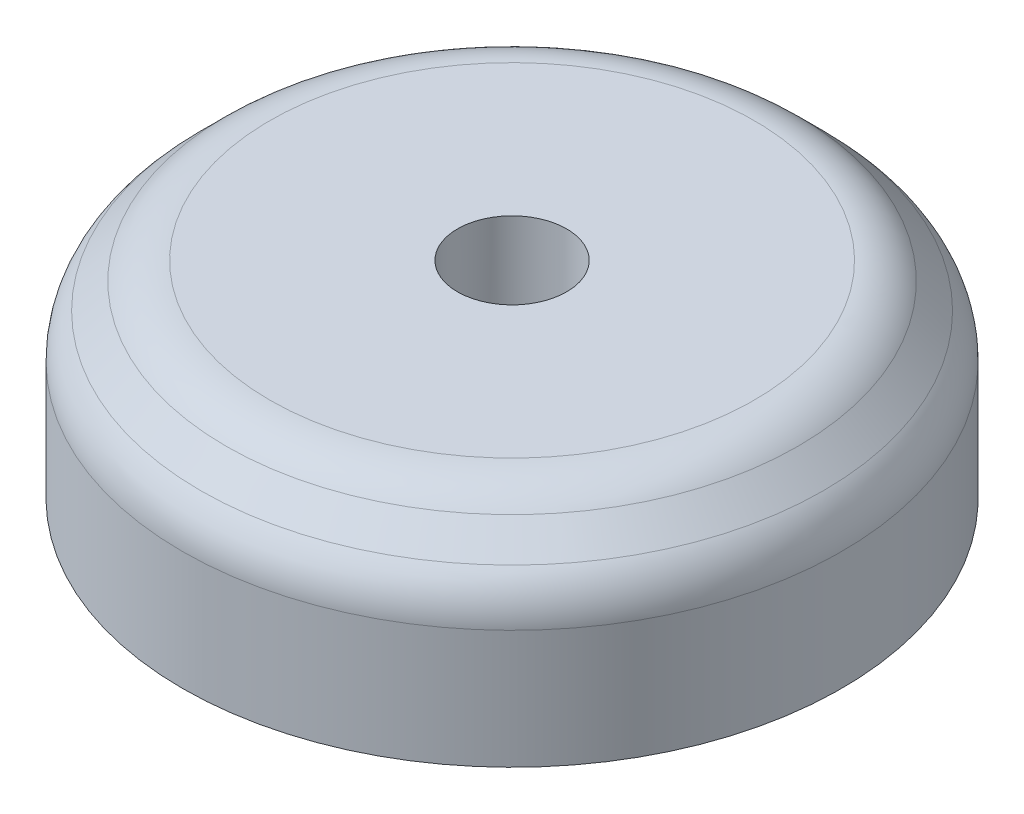
ISO-10303-21;
HEADER;
FILE_DESCRIPTION(('STEP AP214'),'2;1');
FILE_NAME('part.step','',(''),(''),'','','');
FILE_SCHEMA(('AUTOMOTIVE_DESIGN { 1 0 10303 214 1 1 1 1 }'));
ENDSEC;
DATA;
#1=APPLICATION_CONTEXT('core data for automotive mechanical design processes');
#2=APPLICATION_PROTOCOL_DEFINITION('international standard','automotive_design',2000,#1);
#3=PRODUCT_CONTEXT('',#1,'mechanical');
#4=PRODUCT('Part','Part','',(#3));
#5=PRODUCT_RELATED_PRODUCT_CATEGORY('part','',(#4));
#6=PRODUCT_DEFINITION_FORMATION('','',#4);
#7=PRODUCT_DEFINITION_CONTEXT('part definition',#1,'design');
#8=PRODUCT_DEFINITION('design','',#6,#7);
#9=PRODUCT_DEFINITION_SHAPE('','',#8);
#10=(LENGTH_UNIT() NAMED_UNIT(*) SI_UNIT(.MILLI.,.METRE.));
#11=(NAMED_UNIT(*) PLANE_ANGLE_UNIT() SI_UNIT($,.RADIAN.));
#12=(NAMED_UNIT(*) SI_UNIT($,.STERADIAN.) SOLID_ANGLE_UNIT());
#13=UNCERTAINTY_MEASURE_WITH_UNIT(LENGTH_MEASURE(1.E-05),#10,'distance_accuracy_value','');
#14=(GEOMETRIC_REPRESENTATION_CONTEXT(3) GLOBAL_UNCERTAINTY_ASSIGNED_CONTEXT((#13)) GLOBAL_UNIT_ASSIGNED_CONTEXT((#10,
#11,#12)) REPRESENTATION_CONTEXT('',''));
#15=CARTESIAN_POINT('',(0.,0.,0.));
#16=DIRECTION('',(0.,0.,1.));
#17=DIRECTION('',(1.,0.,0.));
#18=AXIS2_PLACEMENT_3D('',#15,#16,#17);
#19=CARTESIAN_POINT('',(0.,0.,0.));
#20=DIRECTION('',(0.,1.,0.));
#21=DIRECTION('',(0.,0.,1.));
#22=AXIS2_PLACEMENT_3D('',#19,#20,#21);
#23=CYLINDRICAL_SURFACE('',#22,2.65);
#24=CARTESIAN_POINT('',(0.,10.,0.));
#25=DIRECTION('',(0.,1.,0.));
#26=DIRECTION('',(0.,0.,1.));
#27=AXIS2_PLACEMENT_3D('',#24,#25,#26);
#28=CIRCLE('',#27,2.65);
#29=CARTESIAN_POINT('',(0.,10.,2.65));
#30=VERTEX_POINT('',#29);
#31=EDGE_CURVE('E62',#30,#30,#28,.T.);
#32=ORIENTED_EDGE('',*,*,#31,.T.);
#33=EDGE_LOOP('',(#32));
#34=FACE_BOUND('',#33,.T.);
#35=CARTESIAN_POINT('',(0.,5.,0.));
#36=DIRECTION('',(0.,-1.,0.));
#37=DIRECTION('',(0.,0.,-1.));
#38=AXIS2_PLACEMENT_3D('',#35,#36,#37);
#39=CIRCLE('',#38,2.65);
#40=CARTESIAN_POINT('',(0.,5.,-2.65));
#41=VERTEX_POINT('',#40);
#42=EDGE_CURVE('E43',#41,#41,#39,.F.);
#43=ORIENTED_EDGE('',*,*,#42,.F.);
#44=EDGE_LOOP('',(#43));
#45=FACE_BOUND('',#44,.T.);
#46=ADVANCED_FACE('F39',(#34,#45),#23,.F.);
#47=CARTESIAN_POINT('',(0.,10.,0.));
#48=DIRECTION('',(0.,-1.,0.));
#49=DIRECTION('',(0.,0.,-1.));
#50=AXIS2_PLACEMENT_3D('',#47,#48,#49);
#51=CYLINDRICAL_SURFACE('',#50,16.);
#52=CARTESIAN_POINT('',(0.,5.75735931288071,0.));
#53=DIRECTION('',(0.,1.,0.));
#54=DIRECTION('',(0.,0.,1.));
#55=AXIS2_PLACEMENT_3D('',#52,#53,#54);
#56=CIRCLE('',#55,16.);
#57=CARTESIAN_POINT('',(0.,5.75735931288071,16.));
#58=VERTEX_POINT('',#57);
#59=EDGE_CURVE('E56',#58,#58,#56,.F.);
#60=ORIENTED_EDGE('',*,*,#59,.T.);
#61=EDGE_LOOP('',(#60));
#62=FACE_BOUND('',#61,.T.);
#63=CARTESIAN_POINT('',(0.,0.,0.));
#64=DIRECTION('',(0.,1.,0.));
#65=DIRECTION('',(0.,0.,1.));
#66=AXIS2_PLACEMENT_3D('',#63,#64,#65);
#67=CIRCLE('',#66,16.);
#68=CARTESIAN_POINT('',(0.,0.,16.));
#69=VERTEX_POINT('',#68);
#70=EDGE_CURVE('E59',#69,#69,#67,.T.);
#71=ORIENTED_EDGE('',*,*,#70,.T.);
#72=EDGE_LOOP('',(#71));
#73=FACE_BOUND('',#72,.T.);
#74=ADVANCED_FACE('F78',(#62,#73),#51,.T.);
#75=CARTESIAN_POINT('',(0.,10.,0.));
#76=DIRECTION('',(0.,1.,0.));
#77=DIRECTION('',(0.,0.,1.));
#78=AXIS2_PLACEMENT_3D('',#75,#76,#77);
#79=PLANE('',#78);
#80=ORIENTED_EDGE('',*,*,#31,.F.);
#81=EDGE_LOOP('',(#80));
#82=FACE_BOUND('',#81,.T.);
#83=CARTESIAN_POINT('',(0.,10.,0.));
#84=DIRECTION('',(0.,1.,0.));
#85=DIRECTION('',(0.,0.,1.));
#86=AXIS2_PLACEMENT_3D('',#83,#84,#85);
#87=CIRCLE('',#86,11.7573593128807);
#88=CARTESIAN_POINT('',(0.,10.,11.7573593128807));
#89=VERTEX_POINT('',#88);
#90=EDGE_CURVE('E10',#89,#89,#87,.T.);
#91=ORIENTED_EDGE('',*,*,#90,.T.);
#92=EDGE_LOOP('',(#91));
#93=FACE_BOUND('',#92,.T.);
#94=ADVANCED_FACE('F86',(#82,#93),#79,.T.);
#95=CARTESIAN_POINT('',(0.,0.,0.));
#96=DIRECTION('',(0.,1.,0.));
#97=DIRECTION('',(0.,0.,1.));
#98=AXIS2_PLACEMENT_3D('',#95,#96,#97);
#99=PLANE('',#98);
#100=CARTESIAN_POINT('',(0.,0.,0.));
#101=DIRECTION('',(0.,-1.,0.));
#102=DIRECTION('',(0.,0.,-1.));
#103=AXIS2_PLACEMENT_3D('',#100,#101,#102);
#104=CIRCLE('',#103,15.);
#105=CARTESIAN_POINT('',(0.,0.,-15.));
#106=VERTEX_POINT('',#105);
#107=EDGE_CURVE('E65',#106,#106,#104,.T.);
#108=ORIENTED_EDGE('',*,*,#107,.F.);
#109=EDGE_LOOP('',(#108));
#110=FACE_BOUND('',#109,.T.);
#111=ORIENTED_EDGE('',*,*,#70,.F.);
#112=EDGE_LOOP('',(#111));
#113=FACE_BOUND('',#112,.T.);
#114=ADVANCED_FACE('F94',(#110,#113),#99,.F.);
#115=CARTESIAN_POINT('',(0.,10.,0.));
#116=DIRECTION('',(0.,-1.,0.));
#117=DIRECTION('',(0.,0.,-1.));
#118=AXIS2_PLACEMENT_3D('',#115,#116,#117);
#119=CONICAL_SURFACE('',#118,13.,0.785398163397447);
#120=CARTESIAN_POINT('',(0.,7.87867965644035,0.));
#121=DIRECTION('',(0.,-1.,0.));
#122=DIRECTION('',(0.,0.,-1.));
#123=AXIS2_PLACEMENT_3D('',#120,#121,#122);
#124=CIRCLE('',#123,15.1213203435596);
#125=CARTESIAN_POINT('',(0.,7.87867965644035,-15.1213203435596));
#126=VERTEX_POINT('',#125);
#127=EDGE_CURVE('E47',#126,#126,#124,.F.);
#128=ORIENTED_EDGE('',*,*,#127,.T.);
#129=EDGE_LOOP('',(#128));
#130=FACE_BOUND('',#129,.T.);
#131=CARTESIAN_POINT('',(0.,9.12132034355964,0.));
#132=DIRECTION('',(0.,1.,0.));
#133=DIRECTION('',(0.,0.,1.));
#134=AXIS2_PLACEMENT_3D('',#131,#132,#133);
#135=CIRCLE('',#134,13.8786796564404);
#136=CARTESIAN_POINT('',(0.,9.12132034355964,13.8786796564404));
#137=VERTEX_POINT('',#136);
#138=EDGE_CURVE('E51',#137,#137,#135,.F.);
#139=ORIENTED_EDGE('',*,*,#138,.T.);
#140=EDGE_LOOP('',(#139));
#141=FACE_BOUND('',#140,.T.);
#142=ADVANCED_FACE('F96',(#130,#141),#119,.T.);
#143=CARTESIAN_POINT('',(0.,5.75735931288071,0.));
#144=DIRECTION('',(0.,1.,0.));
#145=DIRECTION('',(0.,0.,1.));
#146=AXIS2_PLACEMENT_3D('',#143,#144,#145);
#147=TOROIDAL_SURFACE('',#146,13.,3.);
#148=ORIENTED_EDGE('',*,*,#127,.F.);
#149=EDGE_LOOP('',(#148));
#150=FACE_BOUND('',#149,.T.);
#151=ORIENTED_EDGE('',*,*,#59,.F.);
#152=EDGE_LOOP('',(#151));
#153=FACE_BOUND('',#152,.T.);
#154=ADVANCED_FACE('F103',(#150,#153),#147,.T.);
#155=CARTESIAN_POINT('',(0.,7.,0.));
#156=DIRECTION('',(0.,1.,0.));
#157=DIRECTION('',(0.,0.,1.));
#158=AXIS2_PLACEMENT_3D('',#155,#156,#157);
#159=TOROIDAL_SURFACE('',#158,11.7573593128807,3.);
#160=ORIENTED_EDGE('',*,*,#138,.F.);
#161=EDGE_LOOP('',(#160));
#162=FACE_BOUND('',#161,.T.);
#163=ORIENTED_EDGE('',*,*,#90,.F.);
#164=EDGE_LOOP('',(#163));
#165=FACE_BOUND('',#164,.T.);
#166=ADVANCED_FACE('F41',(#162,#165),#159,.T.);
#167=CARTESIAN_POINT('',(0.,5.,0.));
#168=DIRECTION('',(0.,-1.,0.));
#169=DIRECTION('',(0.,0.,-1.));
#170=AXIS2_PLACEMENT_3D('',#167,#168,#169);
#171=PLANE('',#170);
#172=CARTESIAN_POINT('',(0.,5.,0.));
#173=DIRECTION('',(0.,-1.,0.));
#174=DIRECTION('',(0.,0.,-1.));
#175=AXIS2_PLACEMENT_3D('',#172,#173,#174);
#176=CIRCLE('',#175,15.);
#177=CARTESIAN_POINT('',(0.,5.,-15.));
#178=VERTEX_POINT('',#177);
#179=EDGE_CURVE('E68',#178,#178,#176,.T.);
#180=ORIENTED_EDGE('',*,*,#179,.T.);
#181=EDGE_LOOP('',(#180));
#182=FACE_BOUND('',#181,.T.);
#183=ORIENTED_EDGE('',*,*,#42,.T.);
#184=EDGE_LOOP('',(#183));
#185=FACE_BOUND('',#184,.T.);
#186=ADVANCED_FACE('F75',(#182,#185),#171,.T.);
#187=CARTESIAN_POINT('',(0.,5.,0.));
#188=DIRECTION('',(0.,-1.,0.));
#189=DIRECTION('',(0.,0.,-1.));
#190=AXIS2_PLACEMENT_3D('',#187,#188,#189);
#191=CYLINDRICAL_SURFACE('',#190,15.);
#192=ORIENTED_EDGE('',*,*,#179,.F.);
#193=EDGE_LOOP('',(#192));
#194=FACE_BOUND('',#193,.T.);
#195=ORIENTED_EDGE('',*,*,#107,.T.);
#196=EDGE_LOOP('',(#195));
#197=FACE_BOUND('',#196,.T.);
#198=ADVANCED_FACE('F91',(#194,#197),#191,.F.);
#199=CLOSED_SHELL('',(#46,#74,#94,#114,#142,#154,#166,#186,#198));
#200=MANIFOLD_SOLID_BREP('B2',#199);
#201=ADVANCED_BREP_SHAPE_REPRESENTATION('',(#18,#200),#14);
#202=SHAPE_DEFINITION_REPRESENTATION(#9,#201);
ENDSEC;
END-ISO-10303-21;
